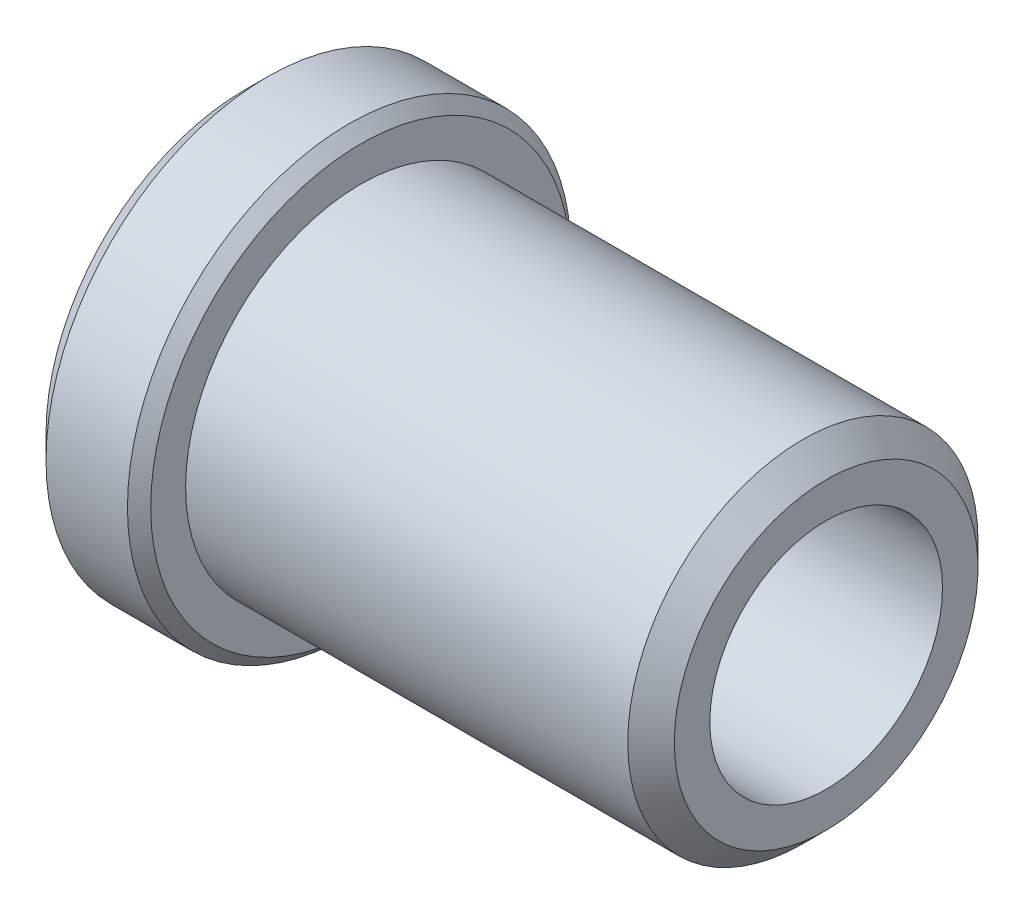
ISO-10303-21;
HEADER;
FILE_DESCRIPTION(('STEP AP214'),'2;1');
FILE_NAME('part.step','',(''),(''),'','','');
FILE_SCHEMA(('AUTOMOTIVE_DESIGN { 1 0 10303 214 1 1 1 1 }'));
ENDSEC;
DATA;
#1=APPLICATION_CONTEXT('core data for automotive mechanical design processes');
#2=APPLICATION_PROTOCOL_DEFINITION('international standard','automotive_design',2000,#1);
#3=PRODUCT_CONTEXT('',#1,'mechanical');
#4=PRODUCT('Part','Part','',(#3));
#5=PRODUCT_RELATED_PRODUCT_CATEGORY('part','',(#4));
#6=PRODUCT_DEFINITION_FORMATION('','',#4);
#7=PRODUCT_DEFINITION_CONTEXT('part definition',#1,'design');
#8=PRODUCT_DEFINITION('design','',#6,#7);
#9=PRODUCT_DEFINITION_SHAPE('','',#8);
#10=(LENGTH_UNIT() NAMED_UNIT(*) SI_UNIT(.MILLI.,.METRE.));
#11=(NAMED_UNIT(*) PLANE_ANGLE_UNIT() SI_UNIT($,.RADIAN.));
#12=(NAMED_UNIT(*) SI_UNIT($,.STERADIAN.) SOLID_ANGLE_UNIT());
#13=UNCERTAINTY_MEASURE_WITH_UNIT(LENGTH_MEASURE(1.E-05),#10,'distance_accuracy_value','');
#14=(GEOMETRIC_REPRESENTATION_CONTEXT(3) GLOBAL_UNCERTAINTY_ASSIGNED_CONTEXT((#13)) GLOBAL_UNIT_ASSIGNED_CONTEXT((#10,
#11,#12)) REPRESENTATION_CONTEXT('',''));
#15=CARTESIAN_POINT('',(0.,0.,0.));
#16=DIRECTION('',(0.,0.,1.));
#17=DIRECTION('',(1.,0.,0.));
#18=AXIS2_PLACEMENT_3D('',#15,#16,#17);
#19=CARTESIAN_POINT('',(0.,7.525,0.));
#20=DIRECTION('',(-1.,0.,0.));
#21=DIRECTION('',(0.,0.,1.));
#22=AXIS2_PLACEMENT_3D('',#19,#20,#21);
#23=PLANE('',#22);
#24=CARTESIAN_POINT('',(0.,0.,0.));
#25=DIRECTION('',(-1.,0.,0.));
#26=DIRECTION('',(0.,0.,1.));
#27=AXIS2_PLACEMENT_3D('',#24,#25,#26);
#28=CIRCLE('',#27,9.025);
#29=CARTESIAN_POINT('',(0.,0.,9.025));
#30=VERTEX_POINT('',#29);
#31=EDGE_CURVE('E10',#30,#30,#28,.F.);
#32=ORIENTED_EDGE('',*,*,#31,.T.);
#33=EDGE_LOOP('',(#32));
#34=FACE_BOUND('',#33,.T.);
#35=CARTESIAN_POINT('',(0.,0.,0.));
#36=DIRECTION('',(-1.,0.,0.));
#37=DIRECTION('',(0.,0.,1.));
#38=AXIS2_PLACEMENT_3D('',#35,#36,#37);
#39=CIRCLE('',#38,7.525);
#40=CARTESIAN_POINT('',(0.,0.,7.525));
#41=VERTEX_POINT('',#40);
#42=EDGE_CURVE('E57',#41,#41,#39,.T.);
#43=ORIENTED_EDGE('',*,*,#42,.T.);
#44=EDGE_LOOP('',(#43));
#45=FACE_BOUND('',#44,.T.);
#46=ADVANCED_FACE('F31',(#34,#45),#23,.F.);
#47=CARTESIAN_POINT('',(-15.2316710306393,0.,0.));
#48=DIRECTION('',(-1.,0.,0.));
#49=DIRECTION('',(0.,0.,1.));
#50=AXIS2_PLACEMENT_3D('',#47,#48,#49);
#51=CYLINDRICAL_SURFACE('',#50,9.525);
#52=CARTESIAN_POINT('',(-0.5,0.,0.));
#53=DIRECTION('',(-1.,0.,0.));
#54=DIRECTION('',(0.,0.,1.));
#55=AXIS2_PLACEMENT_3D('',#52,#53,#54);
#56=CIRCLE('',#55,9.525);
#57=CARTESIAN_POINT('',(-0.5,0.,9.525));
#58=VERTEX_POINT('',#57);
#59=EDGE_CURVE('E38',#58,#58,#56,.T.);
#60=ORIENTED_EDGE('',*,*,#59,.T.);
#61=EDGE_LOOP('',(#60));
#62=FACE_BOUND('',#61,.T.);
#63=CARTESIAN_POINT('',(-3.99999999999999,0.,0.));
#64=DIRECTION('',(1.,0.,0.));
#65=DIRECTION('',(0.,0.,-1.));
#66=AXIS2_PLACEMENT_3D('',#63,#64,#65);
#67=CIRCLE('',#66,9.525);
#68=CARTESIAN_POINT('',(-3.99999999999999,0.,-9.525));
#69=VERTEX_POINT('',#68);
#70=EDGE_CURVE('E51',#69,#69,#67,.T.);
#71=ORIENTED_EDGE('',*,*,#70,.T.);
#72=EDGE_LOOP('',(#71));
#73=FACE_BOUND('',#72,.T.);
#74=ADVANCED_FACE('F76',(#62,#73),#51,.T.);
#75=CARTESIAN_POINT('',(-5.,9.525,0.));
#76=DIRECTION('',(1.,0.,0.));
#77=DIRECTION('',(0.,0.,-1.));
#78=AXIS2_PLACEMENT_3D('',#75,#76,#77);
#79=PLANE('',#78);
#80=CARTESIAN_POINT('',(-5.,0.,0.));
#81=DIRECTION('',(-1.,0.,0.));
#82=DIRECTION('',(0.,0.,1.));
#83=AXIS2_PLACEMENT_3D('',#80,#81,#82);
#84=CIRCLE('',#83,6.);
#85=CARTESIAN_POINT('',(-5.,0.,6.));
#86=VERTEX_POINT('',#85);
#87=EDGE_CURVE('E66',#86,#86,#84,.T.);
#88=ORIENTED_EDGE('',*,*,#87,.F.);
#89=EDGE_LOOP('',(#88));
#90=FACE_BOUND('',#89,.T.);
#91=CARTESIAN_POINT('',(-5.,0.,0.));
#92=DIRECTION('',(1.,0.,0.));
#93=DIRECTION('',(0.,0.,-1.));
#94=AXIS2_PLACEMENT_3D('',#91,#92,#93);
#95=CIRCLE('',#94,8.525);
#96=CARTESIAN_POINT('',(-5.,0.,-8.525));
#97=VERTEX_POINT('',#96);
#98=EDGE_CURVE('E54',#97,#97,#95,.F.);
#99=ORIENTED_EDGE('',*,*,#98,.T.);
#100=EDGE_LOOP('',(#99));
#101=FACE_BOUND('',#100,.T.);
#102=ADVANCED_FACE('F72',(#90,#101),#79,.F.);
#103=CARTESIAN_POINT('',(20.,0.,0.));
#104=DIRECTION('',(-1.,0.,0.));
#105=DIRECTION('',(0.,0.,1.));
#106=AXIS2_PLACEMENT_3D('',#103,#104,#105);
#107=PLANE('',#106);
#108=CARTESIAN_POINT('',(20.,0.,0.));
#109=DIRECTION('',(-1.,0.,0.));
#110=DIRECTION('',(0.,0.,1.));
#111=AXIS2_PLACEMENT_3D('',#108,#109,#110);
#112=CIRCLE('',#111,4.99999999999999);
#113=CARTESIAN_POINT('',(20.,0.,4.99999999999999));
#114=VERTEX_POINT('',#113);
#115=EDGE_CURVE('E60',#114,#114,#112,.T.);
#116=ORIENTED_EDGE('',*,*,#115,.T.);
#117=EDGE_LOOP('',(#116));
#118=FACE_BOUND('',#117,.T.);
#119=CARTESIAN_POINT('',(20.,0.,0.));
#120=DIRECTION('',(-1.,0.,0.));
#121=DIRECTION('',(0.,0.,1.));
#122=AXIS2_PLACEMENT_3D('',#119,#120,#121);
#123=CIRCLE('',#122,6.525);
#124=CARTESIAN_POINT('',(20.,0.,6.525));
#125=VERTEX_POINT('',#124);
#126=EDGE_CURVE('E42',#125,#125,#123,.F.);
#127=ORIENTED_EDGE('',*,*,#126,.T.);
#128=EDGE_LOOP('',(#127));
#129=FACE_BOUND('',#128,.T.);
#130=ADVANCED_FACE('F75',(#118,#129),#107,.F.);
#131=CARTESIAN_POINT('',(-15.2316710306393,0.,0.));
#132=DIRECTION('',(-1.,0.,0.));
#133=DIRECTION('',(0.,0.,1.));
#134=AXIS2_PLACEMENT_3D('',#131,#132,#133);
#135=CYLINDRICAL_SURFACE('',#134,7.525);
#136=CARTESIAN_POINT('',(19.,0.,0.));
#137=DIRECTION('',(-1.,0.,0.));
#138=DIRECTION('',(0.,0.,1.));
#139=AXIS2_PLACEMENT_3D('',#136,#137,#138);
#140=CIRCLE('',#139,7.525);
#141=CARTESIAN_POINT('',(19.,0.,7.525));
#142=VERTEX_POINT('',#141);
#143=EDGE_CURVE('E46',#142,#142,#140,.T.);
#144=ORIENTED_EDGE('',*,*,#143,.T.);
#145=EDGE_LOOP('',(#144));
#146=FACE_BOUND('',#145,.T.);
#147=ORIENTED_EDGE('',*,*,#42,.F.);
#148=EDGE_LOOP('',(#147));
#149=FACE_BOUND('',#148,.T.);
#150=ADVANCED_FACE('F83',(#146,#149),#135,.T.);
#151=CARTESIAN_POINT('',(-5.,0.,0.));
#152=DIRECTION('',(1.,0.,0.));
#153=DIRECTION('',(0.,0.,-1.));
#154=AXIS2_PLACEMENT_3D('',#151,#152,#153);
#155=CONICAL_SURFACE('',#154,8.525,0.785398163397447);
#156=ORIENTED_EDGE('',*,*,#70,.F.);
#157=EDGE_LOOP('',(#156));
#158=FACE_BOUND('',#157,.T.);
#159=ORIENTED_EDGE('',*,*,#98,.F.);
#160=EDGE_LOOP('',(#159));
#161=FACE_BOUND('',#160,.T.);
#162=ADVANCED_FACE('F80',(#158,#161),#155,.T.);
#163=CARTESIAN_POINT('',(19.,0.,0.));
#164=DIRECTION('',(-1.,0.,0.));
#165=DIRECTION('',(0.,0.,1.));
#166=AXIS2_PLACEMENT_3D('',#163,#164,#165);
#167=CONICAL_SURFACE('',#166,7.525,0.785398163397447);
#168=ORIENTED_EDGE('',*,*,#126,.F.);
#169=EDGE_LOOP('',(#168));
#170=FACE_BOUND('',#169,.T.);
#171=ORIENTED_EDGE('',*,*,#143,.F.);
#172=EDGE_LOOP('',(#171));
#173=FACE_BOUND('',#172,.T.);
#174=ADVANCED_FACE('F82',(#170,#173),#167,.T.);
#175=CARTESIAN_POINT('',(-0.5,0.,0.));
#176=DIRECTION('',(-1.,0.,0.));
#177=DIRECTION('',(0.,0.,1.));
#178=AXIS2_PLACEMENT_3D('',#175,#176,#177);
#179=CONICAL_SURFACE('',#178,9.525,0.785398163397452);
#180=ORIENTED_EDGE('',*,*,#31,.F.);
#181=EDGE_LOOP('',(#180));
#182=FACE_BOUND('',#181,.T.);
#183=ORIENTED_EDGE('',*,*,#59,.F.);
#184=EDGE_LOOP('',(#183));
#185=FACE_BOUND('',#184,.T.);
#186=ADVANCED_FACE('F33',(#182,#185),#179,.T.);
#187=CARTESIAN_POINT('',(-5.,0.,0.));
#188=DIRECTION('',(-1.,0.,0.));
#189=DIRECTION('',(0.,0.,1.));
#190=AXIS2_PLACEMENT_3D('',#187,#188,#189);
#191=CYLINDRICAL_SURFACE('',#190,5.);
#192=ORIENTED_EDGE('',*,*,#115,.F.);
#193=EDGE_LOOP('',(#192));
#194=FACE_BOUND('',#193,.T.);
#195=CARTESIAN_POINT('',(-4.,0.,0.));
#196=DIRECTION('',(-1.,0.,0.));
#197=DIRECTION('',(0.,0.,1.));
#198=AXIS2_PLACEMENT_3D('',#195,#196,#197);
#199=CIRCLE('',#198,5.);
#200=CARTESIAN_POINT('',(-4.,0.,5.));
#201=VERTEX_POINT('',#200);
#202=EDGE_CURVE('E63',#201,#201,#199,.T.);
#203=ORIENTED_EDGE('',*,*,#202,.T.);
#204=EDGE_LOOP('',(#203));
#205=FACE_BOUND('',#204,.T.);
#206=ADVANCED_FACE('F105',(#194,#205),#191,.F.);
#207=CARTESIAN_POINT('',(-5.,0.,0.));
#208=DIRECTION('',(-1.,0.,0.));
#209=DIRECTION('',(0.,0.,1.));
#210=AXIS2_PLACEMENT_3D('',#207,#208,#209);
#211=CONICAL_SURFACE('',#210,6.,0.785398163397449);
#212=ORIENTED_EDGE('',*,*,#202,.F.);
#213=EDGE_LOOP('',(#212));
#214=FACE_BOUND('',#213,.T.);
#215=ORIENTED_EDGE('',*,*,#87,.T.);
#216=EDGE_LOOP('',(#215));
#217=FACE_BOUND('',#216,.T.);
#218=ADVANCED_FACE('F70',(#214,#217),#211,.F.);
#219=CLOSED_SHELL('',(#46,#74,#102,#130,#150,#162,#174,#186,#206,#218));
#220=MANIFOLD_SOLID_BREP('B2',#219);
#221=ADVANCED_BREP_SHAPE_REPRESENTATION('',(#18,#220),#14);
#222=SHAPE_DEFINITION_REPRESENTATION(#9,#221);
ENDSEC;
END-ISO-10303-21;
